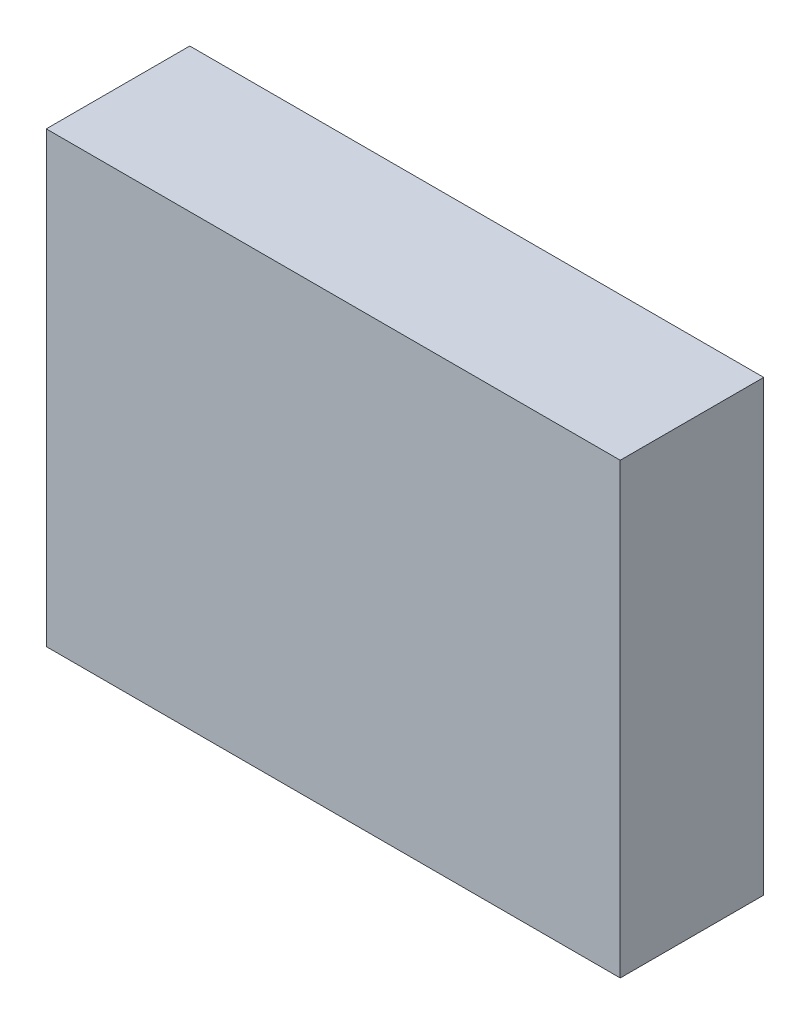
ISO-10303-21;
HEADER;
FILE_DESCRIPTION(('STEP AP214'),'2;1');
FILE_NAME('part.step','',(''),(''),'','','');
FILE_SCHEMA(('AUTOMOTIVE_DESIGN { 1 0 10303 214 1 1 1 1 }'));
ENDSEC;
DATA;
#1=APPLICATION_CONTEXT('core data for automotive mechanical design processes');
#2=APPLICATION_PROTOCOL_DEFINITION('international standard','automotive_design',2000,#1);
#3=PRODUCT_CONTEXT('',#1,'mechanical');
#4=PRODUCT('Part','Part','',(#3));
#5=PRODUCT_RELATED_PRODUCT_CATEGORY('part','',(#4));
#6=PRODUCT_DEFINITION_FORMATION('','',#4);
#7=PRODUCT_DEFINITION_CONTEXT('part definition',#1,'design');
#8=PRODUCT_DEFINITION('design','',#6,#7);
#9=PRODUCT_DEFINITION_SHAPE('','',#8);
#10=(LENGTH_UNIT() NAMED_UNIT(*) SI_UNIT(.MILLI.,.METRE.));
#11=(NAMED_UNIT(*) PLANE_ANGLE_UNIT() SI_UNIT($,.RADIAN.));
#12=(NAMED_UNIT(*) SI_UNIT($,.STERADIAN.) SOLID_ANGLE_UNIT());
#13=UNCERTAINTY_MEASURE_WITH_UNIT(LENGTH_MEASURE(1.E-05),#10,'distance_accuracy_value','');
#14=(GEOMETRIC_REPRESENTATION_CONTEXT(3) GLOBAL_UNCERTAINTY_ASSIGNED_CONTEXT((#13)) GLOBAL_UNIT_ASSIGNED_CONTEXT((#10,
#11,#12)) REPRESENTATION_CONTEXT('',''));
#15=CARTESIAN_POINT('',(0.,0.,0.));
#16=DIRECTION('',(0.,0.,1.));
#17=DIRECTION('',(1.,0.,0.));
#18=AXIS2_PLACEMENT_3D('',#15,#16,#17);
#19=CARTESIAN_POINT('',(-121.,-112.5,192.));
#20=DIRECTION('',(0.,0.,1.));
#21=DIRECTION('',(1.,0.,0.));
#22=AXIS2_PLACEMENT_3D('',#19,#20,#21);
#23=PLANE('',#22);
#24=DIRECTION('',(0.,1.,0.));
#25=VECTOR('',#24,1.);
#26=CARTESIAN_POINT('',(-121.,-112.5,192.));
#27=LINE('',#26,#25);
#28=CARTESIAN_POINT('',(-121.,-112.5,192.));
#29=VERTEX_POINT('',#28);
#30=CARTESIAN_POINT('',(-121.,-87.5,192.));
#31=VERTEX_POINT('',#30);
#32=EDGE_CURVE('E112',#29,#31,#27,.T.);
#33=ORIENTED_EDGE('',*,*,#32,.F.);
#34=DIRECTION('',(1.,0.,0.));
#35=VECTOR('',#34,1.);
#36=CARTESIAN_POINT('',(-121.,-112.5,192.));
#37=LINE('',#36,#35);
#38=CARTESIAN_POINT('',(-89.,-112.5,192.));
#39=VERTEX_POINT('',#38);
#40=EDGE_CURVE('E79',#29,#39,#37,.T.);
#41=ORIENTED_EDGE('',*,*,#40,.T.);
#42=DIRECTION('',(0.,1.,0.));
#43=VECTOR('',#42,1.);
#44=CARTESIAN_POINT('',(-89.,-112.5,192.));
#45=LINE('',#44,#43);
#46=CARTESIAN_POINT('',(-89.,-87.5,192.));
#47=VERTEX_POINT('',#46);
#48=EDGE_CURVE('E89',#39,#47,#45,.T.);
#49=ORIENTED_EDGE('',*,*,#48,.T.);
#50=DIRECTION('',(1.,0.,0.));
#51=VECTOR('',#50,1.);
#52=CARTESIAN_POINT('',(-121.,-87.5,192.));
#53=LINE('',#52,#51);
#54=EDGE_CURVE('E10',#31,#47,#53,.T.);
#55=ORIENTED_EDGE('',*,*,#54,.F.);
#56=EDGE_LOOP('',(#33,#41,#49,#55));
#57=FACE_BOUND('',#56,.T.);
#58=ADVANCED_FACE('F15',(#57),#23,.T.);
#59=CARTESIAN_POINT('',(-121.,-112.5,184.));
#60=DIRECTION('',(0.,0.,1.));
#61=DIRECTION('',(1.,0.,0.));
#62=AXIS2_PLACEMENT_3D('',#59,#60,#61);
#63=PLANE('',#62);
#64=DIRECTION('',(1.,0.,0.));
#65=VECTOR('',#64,1.);
#66=CARTESIAN_POINT('',(-121.,-87.5,184.));
#67=LINE('',#66,#65);
#68=CARTESIAN_POINT('',(-121.,-87.5,184.));
#69=VERTEX_POINT('',#68);
#70=CARTESIAN_POINT('',(-89.,-87.5,184.));
#71=VERTEX_POINT('',#70);
#72=EDGE_CURVE('E25',#69,#71,#67,.T.);
#73=ORIENTED_EDGE('',*,*,#72,.T.);
#74=DIRECTION('',(0.,1.,0.));
#75=VECTOR('',#74,1.);
#76=CARTESIAN_POINT('',(-89.,-112.5,184.));
#77=LINE('',#76,#75);
#78=CARTESIAN_POINT('',(-89.,-112.5,184.));
#79=VERTEX_POINT('',#78);
#80=EDGE_CURVE('E81',#79,#71,#77,.T.);
#81=ORIENTED_EDGE('',*,*,#80,.F.);
#82=DIRECTION('',(1.,0.,0.));
#83=VECTOR('',#82,1.);
#84=CARTESIAN_POINT('',(-121.,-112.5,184.));
#85=LINE('',#84,#83);
#86=CARTESIAN_POINT('',(-121.,-112.5,184.));
#87=VERTEX_POINT('',#86);
#88=EDGE_CURVE('E69',#87,#79,#85,.T.);
#89=ORIENTED_EDGE('',*,*,#88,.F.);
#90=DIRECTION('',(0.,1.,0.));
#91=VECTOR('',#90,1.);
#92=CARTESIAN_POINT('',(-121.,-112.5,184.));
#93=LINE('',#92,#91);
#94=EDGE_CURVE('E95',#87,#69,#93,.T.);
#95=ORIENTED_EDGE('',*,*,#94,.T.);
#96=EDGE_LOOP('',(#73,#81,#89,#95));
#97=FACE_BOUND('',#96,.T.);
#98=ADVANCED_FACE('F82',(#97),#63,.F.);
#99=CARTESIAN_POINT('',(-121.,-87.5,184.));
#100=DIRECTION('',(0.,1.,0.));
#101=DIRECTION('',(1.,0.,0.));
#102=AXIS2_PLACEMENT_3D('',#99,#100,#101);
#103=PLANE('',#102);
#104=ORIENTED_EDGE('',*,*,#72,.F.);
#105=DIRECTION('',(0.,0.,1.));
#106=VECTOR('',#105,1.);
#107=CARTESIAN_POINT('',(-121.,-87.5,184.));
#108=LINE('',#107,#106);
#109=EDGE_CURVE('E107',#69,#31,#108,.T.);
#110=ORIENTED_EDGE('',*,*,#109,.T.);
#111=ORIENTED_EDGE('',*,*,#54,.T.);
#112=DIRECTION('',(0.,0.,1.));
#113=VECTOR('',#112,1.);
#114=CARTESIAN_POINT('',(-89.,-87.5,184.));
#115=LINE('',#114,#113);
#116=EDGE_CURVE('E86',#71,#47,#115,.T.);
#117=ORIENTED_EDGE('',*,*,#116,.F.);
#118=EDGE_LOOP('',(#104,#110,#111,#117));
#119=FACE_BOUND('',#118,.T.);
#120=ADVANCED_FACE('F125',(#119),#103,.T.);
#121=CARTESIAN_POINT('',(-121.,-112.5,184.));
#122=DIRECTION('',(0.,1.,0.));
#123=DIRECTION('',(1.,0.,0.));
#124=AXIS2_PLACEMENT_3D('',#121,#122,#123);
#125=PLANE('',#124);
#126=DIRECTION('',(0.,0.,1.));
#127=VECTOR('',#126,1.);
#128=CARTESIAN_POINT('',(-89.,-112.5,184.));
#129=LINE('',#128,#127);
#130=EDGE_CURVE('E73',#79,#39,#129,.T.);
#131=ORIENTED_EDGE('',*,*,#130,.T.);
#132=ORIENTED_EDGE('',*,*,#40,.F.);
#133=DIRECTION('',(0.,0.,1.));
#134=VECTOR('',#133,1.);
#135=CARTESIAN_POINT('',(-121.,-112.5,184.));
#136=LINE('',#135,#134);
#137=EDGE_CURVE('E75',#87,#29,#136,.T.);
#138=ORIENTED_EDGE('',*,*,#137,.F.);
#139=ORIENTED_EDGE('',*,*,#88,.T.);
#140=EDGE_LOOP('',(#131,#132,#138,#139));
#141=FACE_BOUND('',#140,.T.);
#142=ADVANCED_FACE('F71',(#141),#125,.F.);
#143=CARTESIAN_POINT('',(-89.,-112.5,184.));
#144=DIRECTION('',(1.,0.,0.));
#145=DIRECTION('',(0.,1.,0.));
#146=AXIS2_PLACEMENT_3D('',#143,#144,#145);
#147=PLANE('',#146);
#148=ORIENTED_EDGE('',*,*,#130,.F.);
#149=ORIENTED_EDGE('',*,*,#80,.T.);
#150=ORIENTED_EDGE('',*,*,#116,.T.);
#151=ORIENTED_EDGE('',*,*,#48,.F.);
#152=EDGE_LOOP('',(#148,#149,#150,#151));
#153=FACE_BOUND('',#152,.T.);
#154=ADVANCED_FACE('F17',(#153),#147,.T.);
#155=CARTESIAN_POINT('',(-121.,-112.5,184.));
#156=DIRECTION('',(1.,0.,0.));
#157=DIRECTION('',(0.,1.,0.));
#158=AXIS2_PLACEMENT_3D('',#155,#156,#157);
#159=PLANE('',#158);
#160=ORIENTED_EDGE('',*,*,#32,.T.);
#161=ORIENTED_EDGE('',*,*,#109,.F.);
#162=ORIENTED_EDGE('',*,*,#94,.F.);
#163=ORIENTED_EDGE('',*,*,#137,.T.);
#164=EDGE_LOOP('',(#160,#161,#162,#163));
#165=FACE_BOUND('',#164,.T.);
#166=ADVANCED_FACE('F118',(#165),#159,.F.);
#167=CLOSED_SHELL('',(#58,#98,#120,#142,#154,#166));
#168=MANIFOLD_SOLID_BREP('B1',#167);
#169=ADVANCED_BREP_SHAPE_REPRESENTATION('',(#18,#168),#14);
#170=SHAPE_DEFINITION_REPRESENTATION(#9,#169);
ENDSEC;
END-ISO-10303-21;
